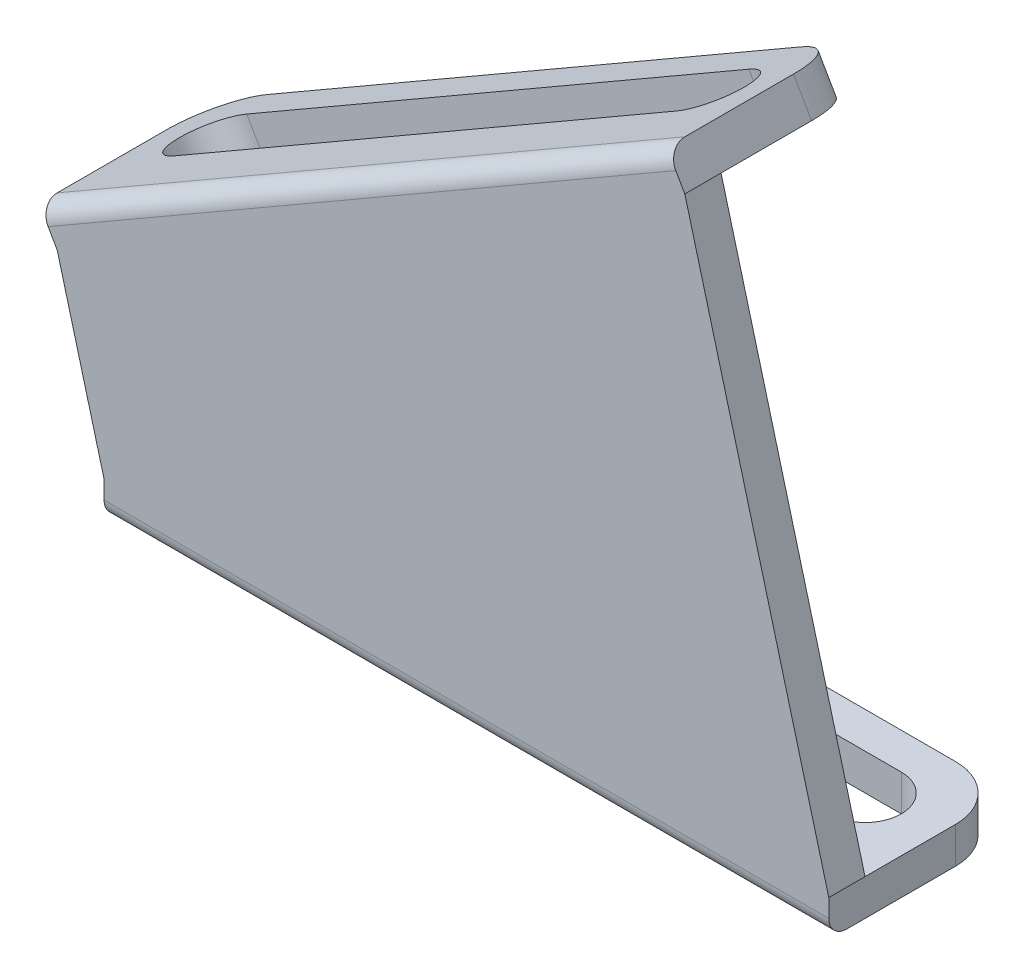
ISO-10303-21;
HEADER;
FILE_DESCRIPTION(('STEP AP214'),'2;1');
FILE_NAME('part.step','',(''),(''),'','','');
FILE_SCHEMA(('AUTOMOTIVE_DESIGN { 1 0 10303 214 1 1 1 1 }'));
ENDSEC;
DATA;
#1=APPLICATION_CONTEXT('core data for automotive mechanical design processes');
#2=APPLICATION_PROTOCOL_DEFINITION('international standard','automotive_design',2000,#1);
#3=PRODUCT_CONTEXT('',#1,'mechanical');
#4=PRODUCT('Part','Part','',(#3));
#5=PRODUCT_RELATED_PRODUCT_CATEGORY('part','',(#4));
#6=PRODUCT_DEFINITION_FORMATION('','',#4);
#7=PRODUCT_DEFINITION_CONTEXT('part definition',#1,'design');
#8=PRODUCT_DEFINITION('design','',#6,#7);
#9=PRODUCT_DEFINITION_SHAPE('','',#8);
#10=(LENGTH_UNIT() NAMED_UNIT(*) SI_UNIT(.MILLI.,.METRE.));
#11=(NAMED_UNIT(*) PLANE_ANGLE_UNIT() SI_UNIT($,.RADIAN.));
#12=(NAMED_UNIT(*) SI_UNIT($,.STERADIAN.) SOLID_ANGLE_UNIT());
#13=UNCERTAINTY_MEASURE_WITH_UNIT(LENGTH_MEASURE(1.E-05),#10,'distance_accuracy_value','');
#14=(GEOMETRIC_REPRESENTATION_CONTEXT(3) GLOBAL_UNCERTAINTY_ASSIGNED_CONTEXT((#13)) GLOBAL_UNIT_ASSIGNED_CONTEXT((#10,
#11,#12)) REPRESENTATION_CONTEXT('',''));
#15=CARTESIAN_POINT('',(0.,0.,0.));
#16=DIRECTION('',(0.,0.,1.));
#17=DIRECTION('',(1.,0.,0.));
#18=AXIS2_PLACEMENT_3D('',#15,#16,#17);
#19=CARTESIAN_POINT('',(3.,2.,-7.));
#20=DIRECTION('',(0.,-1.,0.));
#21=DIRECTION('',(0.,0.,-1.));
#22=AXIS2_PLACEMENT_3D('',#19,#20,#21);
#23=PLANE('',#22);
#24=DIRECTION('',(0.,0.,1.));
#25=VECTOR('',#24,1.);
#26=CARTESIAN_POINT('',(0.,2.,0.));
#27=LINE('',#26,#25);
#28=CARTESIAN_POINT('',(0.,2.,-6.99999999999998));
#29=VERTEX_POINT('',#28);
#30=CARTESIAN_POINT('',(0.,2.,-2.));
#31=VERTEX_POINT('',#30);
#32=EDGE_CURVE('E330',#29,#31,#27,.T.);
#33=ORIENTED_EDGE('',*,*,#32,.T.);
#34=DIRECTION('',(1.,0.,0.));
#35=VECTOR('',#34,1.);
#36=CARTESIAN_POINT('',(0.,2.,-2.));
#37=LINE('',#36,#35);
#38=CARTESIAN_POINT('',(40.,2.,-2.));
#39=VERTEX_POINT('',#38);
#40=EDGE_CURVE('E273',#31,#39,#37,.T.);
#41=ORIENTED_EDGE('',*,*,#40,.T.);
#42=DIRECTION('',(0.,0.,-1.));
#43=VECTOR('',#42,1.);
#44=CARTESIAN_POINT('',(40.,2.,0.));
#45=LINE('',#44,#43);
#46=CARTESIAN_POINT('',(40.,2.,-6.99999999999998));
#47=VERTEX_POINT('',#46);
#48=EDGE_CURVE('E333',#39,#47,#45,.T.);
#49=ORIENTED_EDGE('',*,*,#48,.T.);
#50=CARTESIAN_POINT('',(37.,2.,-7.));
#51=DIRECTION('',(0.,1.,0.));
#52=DIRECTION('',(0.,0.,-1.));
#53=AXIS2_PLACEMENT_3D('',#50,#51,#52);
#54=CIRCLE('',#53,3.);
#55=CARTESIAN_POINT('',(37.,2.,-10.));
#56=VERTEX_POINT('',#55);
#57=EDGE_CURVE('E338',#47,#56,#54,.T.);
#58=ORIENTED_EDGE('',*,*,#57,.T.);
#59=DIRECTION('',(-1.,0.,0.));
#60=VECTOR('',#59,1.);
#61=CARTESIAN_POINT('',(3.00000000000002,2.,-10.));
#62=LINE('',#61,#60);
#63=CARTESIAN_POINT('',(3.00000000000002,2.,-10.));
#64=VERTEX_POINT('',#63);
#65=EDGE_CURVE('E340',#56,#64,#62,.T.);
#66=ORIENTED_EDGE('',*,*,#65,.T.);
#67=CARTESIAN_POINT('',(3.,2.,-7.));
#68=DIRECTION('',(0.,1.,0.));
#69=DIRECTION('',(0.,0.,-1.));
#70=AXIS2_PLACEMENT_3D('',#67,#68,#69);
#71=CIRCLE('',#70,3.);
#72=EDGE_CURVE('E342',#64,#29,#71,.T.);
#73=ORIENTED_EDGE('',*,*,#72,.T.);
#74=EDGE_LOOP('',(#33,#41,#49,#58,#66,#73));
#75=FACE_BOUND('',#74,.T.);
#76=CARTESIAN_POINT('',(4.,2.,-6.));
#77=DIRECTION('',(0.,1.,0.));
#78=DIRECTION('',(0.,0.,1.));
#79=AXIS2_PLACEMENT_3D('',#76,#77,#78);
#80=CIRCLE('',#79,2.);
#81=CARTESIAN_POINT('',(4.,2.,-8.));
#82=VERTEX_POINT('',#81);
#83=CARTESIAN_POINT('',(4.,2.,-4.));
#84=VERTEX_POINT('',#83);
#85=EDGE_CURVE('E299',#82,#84,#80,.T.);
#86=ORIENTED_EDGE('',*,*,#85,.F.);
#87=DIRECTION('',(-1.,0.,0.));
#88=VECTOR('',#87,1.);
#89=CARTESIAN_POINT('',(4.,2.,-8.));
#90=LINE('',#89,#88);
#91=CARTESIAN_POINT('',(36.,2.,-8.));
#92=VERTEX_POINT('',#91);
#93=EDGE_CURVE('E307',#92,#82,#90,.T.);
#94=ORIENTED_EDGE('',*,*,#93,.F.);
#95=CARTESIAN_POINT('',(36.,2.,-6.));
#96=DIRECTION('',(0.,1.,0.));
#97=DIRECTION('',(0.,0.,1.));
#98=AXIS2_PLACEMENT_3D('',#95,#96,#97);
#99=CIRCLE('',#98,2.);
#100=CARTESIAN_POINT('',(36.,2.,-4.));
#101=VERTEX_POINT('',#100);
#102=EDGE_CURVE('E304',#101,#92,#99,.T.);
#103=ORIENTED_EDGE('',*,*,#102,.F.);
#104=DIRECTION('',(1.,0.,0.));
#105=VECTOR('',#104,1.);
#106=CARTESIAN_POINT('',(36.,2.,-4.));
#107=LINE('',#106,#105);
#108=EDGE_CURVE('E301',#84,#101,#107,.T.);
#109=ORIENTED_EDGE('',*,*,#108,.F.);
#110=EDGE_LOOP('',(#86,#94,#103,#109));
#111=FACE_BOUND('',#110,.T.);
#112=ADVANCED_FACE('F33',(#75,#111),#23,.F.);
#113=CARTESIAN_POINT('',(3.,0.,-7.));
#114=DIRECTION('',(0.,-1.,0.));
#115=DIRECTION('',(0.,0.,-1.));
#116=AXIS2_PLACEMENT_3D('',#113,#114,#115);
#117=PLANE('',#116);
#118=DIRECTION('',(0.,0.,-1.));
#119=VECTOR('',#118,1.);
#120=CARTESIAN_POINT('',(40.,0.,0.));
#121=LINE('',#120,#119);
#122=CARTESIAN_POINT('',(40.,0.,-1.));
#123=VERTEX_POINT('',#122);
#124=CARTESIAN_POINT('',(40.,0.,-6.99999999999998));
#125=VERTEX_POINT('',#124);
#126=EDGE_CURVE('E347',#123,#125,#121,.T.);
#127=ORIENTED_EDGE('',*,*,#126,.F.);
#128=DIRECTION('',(1.,0.,0.));
#129=VECTOR('',#128,1.);
#130=CARTESIAN_POINT('',(0.,0.,-1.));
#131=LINE('',#130,#129);
#132=CARTESIAN_POINT('',(0.,0.,-1.));
#133=VERTEX_POINT('',#132);
#134=EDGE_CURVE('E376',#123,#133,#131,.F.);
#135=ORIENTED_EDGE('',*,*,#134,.T.);
#136=DIRECTION('',(0.,0.,1.));
#137=VECTOR('',#136,1.);
#138=CARTESIAN_POINT('',(0.,0.,0.));
#139=LINE('',#138,#137);
#140=CARTESIAN_POINT('',(0.,0.,-6.99999999999998));
#141=VERTEX_POINT('',#140);
#142=EDGE_CURVE('E329',#141,#133,#139,.T.);
#143=ORIENTED_EDGE('',*,*,#142,.F.);
#144=CARTESIAN_POINT('',(3.,0.,-7.));
#145=DIRECTION('',(0.,1.,0.));
#146=DIRECTION('',(0.,0.,-1.));
#147=AXIS2_PLACEMENT_3D('',#144,#145,#146);
#148=CIRCLE('',#147,3.);
#149=CARTESIAN_POINT('',(3.00000000000002,0.,-10.));
#150=VERTEX_POINT('',#149);
#151=EDGE_CURVE('E334',#150,#141,#148,.T.);
#152=ORIENTED_EDGE('',*,*,#151,.F.);
#153=DIRECTION('',(-1.,0.,0.));
#154=VECTOR('',#153,1.);
#155=CARTESIAN_POINT('',(3.00000000000002,0.,-10.));
#156=LINE('',#155,#154);
#157=CARTESIAN_POINT('',(37.,0.,-10.));
#158=VERTEX_POINT('',#157);
#159=EDGE_CURVE('E351',#158,#150,#156,.T.);
#160=ORIENTED_EDGE('',*,*,#159,.F.);
#161=CARTESIAN_POINT('',(37.,0.,-7.));
#162=DIRECTION('',(0.,1.,0.));
#163=DIRECTION('',(0.,0.,-1.));
#164=AXIS2_PLACEMENT_3D('',#161,#162,#163);
#165=CIRCLE('',#164,3.);
#166=EDGE_CURVE('E349',#125,#158,#165,.T.);
#167=ORIENTED_EDGE('',*,*,#166,.F.);
#168=EDGE_LOOP('',(#127,#135,#143,#152,#160,#167));
#169=FACE_BOUND('',#168,.T.);
#170=DIRECTION('',(-1.,0.,0.));
#171=VECTOR('',#170,1.);
#172=CARTESIAN_POINT('',(4.,0.,-8.));
#173=LINE('',#172,#171);
#174=CARTESIAN_POINT('',(36.,0.,-8.));
#175=VERTEX_POINT('',#174);
#176=CARTESIAN_POINT('',(4.,0.,-8.));
#177=VERTEX_POINT('',#176);
#178=EDGE_CURVE('E302',#175,#177,#173,.T.);
#179=ORIENTED_EDGE('',*,*,#178,.T.);
#180=CARTESIAN_POINT('',(4.,0.,-6.));
#181=DIRECTION('',(0.,1.,0.));
#182=DIRECTION('',(0.,0.,1.));
#183=AXIS2_PLACEMENT_3D('',#180,#181,#182);
#184=CIRCLE('',#183,2.);
#185=CARTESIAN_POINT('',(4.,0.,-4.));
#186=VERTEX_POINT('',#185);
#187=EDGE_CURVE('E293',#177,#186,#184,.T.);
#188=ORIENTED_EDGE('',*,*,#187,.T.);
#189=DIRECTION('',(1.,0.,0.));
#190=VECTOR('',#189,1.);
#191=CARTESIAN_POINT('',(36.,0.,-4.));
#192=LINE('',#191,#190);
#193=CARTESIAN_POINT('',(36.,0.,-4.));
#194=VERTEX_POINT('',#193);
#195=EDGE_CURVE('E312',#186,#194,#192,.T.);
#196=ORIENTED_EDGE('',*,*,#195,.T.);
#197=CARTESIAN_POINT('',(36.,0.,-6.));
#198=DIRECTION('',(0.,1.,0.));
#199=DIRECTION('',(0.,0.,1.));
#200=AXIS2_PLACEMENT_3D('',#197,#198,#199);
#201=CIRCLE('',#200,2.);
#202=EDGE_CURVE('E315',#194,#175,#201,.T.);
#203=ORIENTED_EDGE('',*,*,#202,.T.);
#204=EDGE_LOOP('',(#179,#188,#196,#203));
#205=FACE_BOUND('',#204,.T.);
#206=ADVANCED_FACE('F418',(#169,#205),#117,.T.);
#207=CARTESIAN_POINT('',(0.,2.,0.));
#208=DIRECTION('',(1.,0.,0.));
#209=DIRECTION('',(0.,0.,-1.));
#210=AXIS2_PLACEMENT_3D('',#207,#208,#209);
#211=PLANE('',#210);
#212=ORIENTED_EDGE('',*,*,#142,.T.);
#213=CARTESIAN_POINT('',(0.,1.,-1.));
#214=DIRECTION('',(1.,0.,0.));
#215=DIRECTION('',(0.,0.,-1.));
#216=AXIS2_PLACEMENT_3D('',#213,#214,#215);
#217=CIRCLE('',#216,1.);
#218=CARTESIAN_POINT('',(0.,1.,0.));
#219=VERTEX_POINT('',#218);
#220=EDGE_CURVE('E378',#133,#219,#217,.F.);
#221=ORIENTED_EDGE('',*,*,#220,.T.);
#222=DIRECTION('',(0.,-1.,0.));
#223=VECTOR('',#222,1.);
#224=CARTESIAN_POINT('',(0.,2.,0.));
#225=LINE('',#224,#223);
#226=CARTESIAN_POINT('',(0.,2.,0.));
#227=VERTEX_POINT('',#226);
#228=EDGE_CURVE('E368',#227,#219,#225,.T.);
#229=ORIENTED_EDGE('',*,*,#228,.F.);
#230=DIRECTION('',(0.,0.,1.));
#231=VECTOR('',#230,1.);
#232=CARTESIAN_POINT('',(0.,2.,-2.));
#233=LINE('',#232,#231);
#234=EDGE_CURVE('E291',#31,#227,#233,.T.);
#235=ORIENTED_EDGE('',*,*,#234,.F.);
#236=ORIENTED_EDGE('',*,*,#32,.F.);
#237=DIRECTION('',(0.,-1.,0.));
#238=VECTOR('',#237,1.);
#239=CARTESIAN_POINT('',(0.,2.,-6.99999999999998));
#240=LINE('',#239,#238);
#241=EDGE_CURVE('E344',#29,#141,#240,.T.);
#242=ORIENTED_EDGE('',*,*,#241,.T.);
#243=EDGE_LOOP('',(#212,#221,#229,#235,#236,#242));
#244=FACE_BOUND('',#243,.T.);
#245=ADVANCED_FACE('F424',(#244),#211,.F.);
#246=CARTESIAN_POINT('',(0.,2.,0.));
#247=DIRECTION('',(0.,0.,-1.));
#248=DIRECTION('',(-1.,0.,0.));
#249=AXIS2_PLACEMENT_3D('',#246,#247,#248);
#250=PLANE('',#249);
#251=DIRECTION('',(0.500000000000001,-0.866025403784438,0.));
#252=VECTOR('',#251,1.);
#253=CARTESIAN_POINT('',(31.0528257003524,33.3913090704597,0.));
#254=LINE('',#253,#252);
#255=CARTESIAN_POINT('',(31.5528257003524,32.5252836666752,0.));
#256=VERTEX_POINT('',#255);
#257=CARTESIAN_POINT('',(32.0528257003524,31.6592582628908,0.));
#258=VERTEX_POINT('',#257);
#259=EDGE_CURVE('E268',#256,#258,#254,.T.);
#260=ORIENTED_EDGE('',*,*,#259,.F.);
#261=DIRECTION('',(0.866025403784438,0.500000000000001,0.));
#262=VECTOR('',#261,1.);
#263=CARTESIAN_POINT('',(-5.32962913144536,11.2311884411625,0.));
#264=LINE('',#263,#262);
#265=CARTESIAN_POINT('',(-3.08819045102525,12.5252836666751,0.));
#266=VERTEX_POINT('',#265);
#267=EDGE_CURVE('E41',#256,#266,#264,.F.);
#268=ORIENTED_EDGE('',*,*,#267,.T.);
#269=DIRECTION('',(0.500000000000001,-0.866025403784438,0.));
#270=VECTOR('',#269,1.);
#271=CARTESIAN_POINT('',(-3.58819045102525,13.3913090704595,0.));
#272=LINE('',#271,#270);
#273=CARTESIAN_POINT('',(-2.58819045102525,11.6592582628907,0.));
#274=VERTEX_POINT('',#273);
#275=EDGE_CURVE('E270',#266,#274,#272,.T.);
#276=ORIENTED_EDGE('',*,*,#275,.T.);
#277=DIRECTION('',(0.258819045102525,-0.965925826289067,0.));
#278=VECTOR('',#277,1.);
#279=CARTESIAN_POINT('',(0.,2.,0.));
#280=LINE('',#279,#278);
#281=EDGE_CURVE('E277',#274,#227,#280,.T.);
#282=ORIENTED_EDGE('',*,*,#281,.T.);
#283=ORIENTED_EDGE('',*,*,#228,.T.);
#284=DIRECTION('',(1.,0.,0.));
#285=VECTOR('',#284,1.);
#286=CARTESIAN_POINT('',(40.,1.,0.));
#287=LINE('',#286,#285);
#288=CARTESIAN_POINT('',(40.,1.,0.));
#289=VERTEX_POINT('',#288);
#290=EDGE_CURVE('E371',#219,#289,#287,.T.);
#291=ORIENTED_EDGE('',*,*,#290,.T.);
#292=DIRECTION('',(0.,-1.,0.));
#293=VECTOR('',#292,1.);
#294=CARTESIAN_POINT('',(40.,2.,0.));
#295=LINE('',#294,#293);
#296=CARTESIAN_POINT('',(40.,2.,0.));
#297=VERTEX_POINT('',#296);
#298=EDGE_CURVE('E365',#297,#289,#295,.T.);
#299=ORIENTED_EDGE('',*,*,#298,.F.);
#300=DIRECTION('',(-0.258819045102518,0.965925826289069,0.));
#301=VECTOR('',#300,1.);
#302=CARTESIAN_POINT('',(32.0528257003524,31.6592582628908,0.));
#303=LINE('',#302,#301);
#304=EDGE_CURVE('E272',#297,#258,#303,.T.);
#305=ORIENTED_EDGE('',*,*,#304,.T.);
#306=EDGE_LOOP('',(#260,#268,#276,#282,#283,#291,#299,#305));
#307=FACE_BOUND('',#306,.T.);
#308=ADVANCED_FACE('F447',(#307),#250,.F.);
#309=CARTESIAN_POINT('',(40.,2.,0.));
#310=DIRECTION('',(-1.,0.,0.));
#311=DIRECTION('',(0.,0.,1.));
#312=AXIS2_PLACEMENT_3D('',#309,#310,#311);
#313=PLANE('',#312);
#314=ORIENTED_EDGE('',*,*,#298,.T.);
#315=CARTESIAN_POINT('',(40.,1.,-1.));
#316=DIRECTION('',(-1.,0.,0.));
#317=DIRECTION('',(0.,0.,1.));
#318=AXIS2_PLACEMENT_3D('',#315,#316,#317);
#319=CIRCLE('',#318,1.);
#320=EDGE_CURVE('E374',#289,#123,#319,.F.);
#321=ORIENTED_EDGE('',*,*,#320,.T.);
#322=ORIENTED_EDGE('',*,*,#126,.T.);
#323=DIRECTION('',(0.,-1.,0.));
#324=VECTOR('',#323,1.);
#325=CARTESIAN_POINT('',(40.,2.,-6.99999999999998));
#326=LINE('',#325,#324);
#327=EDGE_CURVE('E362',#47,#125,#326,.T.);
#328=ORIENTED_EDGE('',*,*,#327,.F.);
#329=ORIENTED_EDGE('',*,*,#48,.F.);
#330=EDGE_CURVE('E335',#297,#39,#45,.T.);
#331=ORIENTED_EDGE('',*,*,#330,.F.);
#332=EDGE_LOOP('',(#314,#321,#322,#328,#329,#331));
#333=FACE_BOUND('',#332,.T.);
#334=ADVANCED_FACE('F443',(#333),#313,.F.);
#335=CARTESIAN_POINT('',(37.,2.,-7.));
#336=DIRECTION('',(0.,-1.,0.));
#337=DIRECTION('',(0.,0.,-1.));
#338=AXIS2_PLACEMENT_3D('',#335,#336,#337);
#339=CYLINDRICAL_SURFACE('',#338,3.);
#340=ORIENTED_EDGE('',*,*,#166,.T.);
#341=DIRECTION('',(0.,-1.,0.));
#342=VECTOR('',#341,1.);
#343=CARTESIAN_POINT('',(37.,2.,-10.));
#344=LINE('',#343,#342);
#345=EDGE_CURVE('E359',#56,#158,#344,.T.);
#346=ORIENTED_EDGE('',*,*,#345,.F.);
#347=ORIENTED_EDGE('',*,*,#57,.F.);
#348=ORIENTED_EDGE('',*,*,#327,.T.);
#349=EDGE_LOOP('',(#340,#346,#347,#348));
#350=FACE_BOUND('',#349,.T.);
#351=ADVANCED_FACE('F439',(#350),#339,.T.);
#352=CARTESIAN_POINT('',(3.00000000000002,2.,-10.));
#353=DIRECTION('',(0.,0.,1.));
#354=DIRECTION('',(1.,0.,0.));
#355=AXIS2_PLACEMENT_3D('',#352,#353,#354);
#356=PLANE('',#355);
#357=ORIENTED_EDGE('',*,*,#159,.T.);
#358=DIRECTION('',(0.,-1.,0.));
#359=VECTOR('',#358,1.);
#360=CARTESIAN_POINT('',(3.00000000000002,2.,-10.));
#361=LINE('',#360,#359);
#362=EDGE_CURVE('E356',#64,#150,#361,.T.);
#363=ORIENTED_EDGE('',*,*,#362,.F.);
#364=ORIENTED_EDGE('',*,*,#65,.F.);
#365=ORIENTED_EDGE('',*,*,#345,.T.);
#366=EDGE_LOOP('',(#357,#363,#364,#365));
#367=FACE_BOUND('',#366,.T.);
#368=ADVANCED_FACE('F435',(#367),#356,.F.);
#369=CARTESIAN_POINT('',(3.,2.,-7.));
#370=DIRECTION('',(0.,-1.,0.));
#371=DIRECTION('',(0.,0.,-1.));
#372=AXIS2_PLACEMENT_3D('',#369,#370,#371);
#373=CYLINDRICAL_SURFACE('',#372,3.);
#374=ORIENTED_EDGE('',*,*,#151,.T.);
#375=ORIENTED_EDGE('',*,*,#241,.F.);
#376=ORIENTED_EDGE('',*,*,#72,.F.);
#377=ORIENTED_EDGE('',*,*,#362,.T.);
#378=EDGE_LOOP('',(#374,#375,#376,#377));
#379=FACE_BOUND('',#378,.T.);
#380=ADVANCED_FACE('F432',(#379),#373,.T.);
#381=CARTESIAN_POINT('',(4.,2.,-6.));
#382=DIRECTION('',(0.,-1.,0.));
#383=DIRECTION('',(0.,0.,-1.));
#384=AXIS2_PLACEMENT_3D('',#381,#382,#383);
#385=CYLINDRICAL_SURFACE('',#384,2.);
#386=ORIENTED_EDGE('',*,*,#187,.F.);
#387=DIRECTION('',(0.,-1.,0.));
#388=VECTOR('',#387,1.);
#389=CARTESIAN_POINT('',(4.,2.,-8.));
#390=LINE('',#389,#388);
#391=EDGE_CURVE('E309',#82,#177,#390,.T.);
#392=ORIENTED_EDGE('',*,*,#391,.F.);
#393=ORIENTED_EDGE('',*,*,#85,.T.);
#394=DIRECTION('',(0.,-1.,0.));
#395=VECTOR('',#394,1.);
#396=CARTESIAN_POINT('',(4.,2.,-4.));
#397=LINE('',#396,#395);
#398=EDGE_CURVE('E326',#84,#186,#397,.T.);
#399=ORIENTED_EDGE('',*,*,#398,.T.);
#400=EDGE_LOOP('',(#386,#392,#393,#399));
#401=FACE_BOUND('',#400,.T.);
#402=ADVANCED_FACE('F429',(#401),#385,.F.);
#403=CARTESIAN_POINT('',(36.,2.,-4.));
#404=DIRECTION('',(0.,0.,-1.));
#405=DIRECTION('',(-1.,0.,0.));
#406=AXIS2_PLACEMENT_3D('',#403,#404,#405);
#407=PLANE('',#406);
#408=ORIENTED_EDGE('',*,*,#195,.F.);
#409=ORIENTED_EDGE('',*,*,#398,.F.);
#410=ORIENTED_EDGE('',*,*,#108,.T.);
#411=DIRECTION('',(0.,-1.,0.));
#412=VECTOR('',#411,1.);
#413=CARTESIAN_POINT('',(36.,2.,-4.));
#414=LINE('',#413,#412);
#415=EDGE_CURVE('E324',#101,#194,#414,.T.);
#416=ORIENTED_EDGE('',*,*,#415,.T.);
#417=EDGE_LOOP('',(#408,#409,#410,#416));
#418=FACE_BOUND('',#417,.T.);
#419=ADVANCED_FACE('F522',(#418),#407,.T.);
#420=CARTESIAN_POINT('',(36.,2.,-6.));
#421=DIRECTION('',(0.,-1.,0.));
#422=DIRECTION('',(0.,0.,-1.));
#423=AXIS2_PLACEMENT_3D('',#420,#421,#422);
#424=CYLINDRICAL_SURFACE('',#423,2.);
#425=ORIENTED_EDGE('',*,*,#202,.F.);
#426=ORIENTED_EDGE('',*,*,#415,.F.);
#427=ORIENTED_EDGE('',*,*,#102,.T.);
#428=DIRECTION('',(0.,-1.,0.));
#429=VECTOR('',#428,1.);
#430=CARTESIAN_POINT('',(36.,2.,-8.));
#431=LINE('',#430,#429);
#432=EDGE_CURVE('E322',#92,#175,#431,.T.);
#433=ORIENTED_EDGE('',*,*,#432,.T.);
#434=EDGE_LOOP('',(#425,#426,#427,#433));
#435=FACE_BOUND('',#434,.T.);
#436=ADVANCED_FACE('F519',(#435),#424,.F.);
#437=CARTESIAN_POINT('',(4.,2.,-8.));
#438=DIRECTION('',(0.,0.,1.));
#439=DIRECTION('',(1.,0.,0.));
#440=AXIS2_PLACEMENT_3D('',#437,#438,#439);
#441=PLANE('',#440);
#442=ORIENTED_EDGE('',*,*,#178,.F.);
#443=ORIENTED_EDGE('',*,*,#432,.F.);
#444=ORIENTED_EDGE('',*,*,#93,.T.);
#445=ORIENTED_EDGE('',*,*,#391,.T.);
#446=EDGE_LOOP('',(#442,#443,#444,#445));
#447=FACE_BOUND('',#446,.T.);
#448=ADVANCED_FACE('F514',(#447),#441,.T.);
#449=CARTESIAN_POINT('',(0.,2.,-2.));
#450=DIRECTION('',(-0.965925826289067,-0.258819045102525,0.));
#451=DIRECTION('',(0.258819045102525,-0.965925826289067,0.));
#452=AXIS2_PLACEMENT_3D('',#449,#450,#451);
#453=PLANE('',#452);
#454=ORIENTED_EDGE('',*,*,#281,.F.);
#455=DIRECTION('',(0.,0.,1.));
#456=VECTOR('',#455,1.);
#457=CARTESIAN_POINT('',(-2.58819045102525,11.6592582628907,-2.));
#458=LINE('',#457,#456);
#459=CARTESIAN_POINT('',(-2.58819045102525,11.6592582628907,-2.));
#460=VERTEX_POINT('',#459);
#461=EDGE_CURVE('E294',#460,#274,#458,.T.);
#462=ORIENTED_EDGE('',*,*,#461,.F.);
#463=DIRECTION('',(0.258819045102525,-0.965925826289067,0.));
#464=VECTOR('',#463,1.);
#465=CARTESIAN_POINT('',(0.,2.,-2.));
#466=LINE('',#465,#464);
#467=EDGE_CURVE('E283',#460,#31,#466,.T.);
#468=ORIENTED_EDGE('',*,*,#467,.T.);
#469=ORIENTED_EDGE('',*,*,#234,.T.);
#470=EDGE_LOOP('',(#454,#462,#468,#469));
#471=FACE_BOUND('',#470,.T.);
#472=ADVANCED_FACE('F476',(#471),#453,.T.);
#473=CARTESIAN_POINT('',(32.0528257003524,31.6592582628908,-2.));
#474=DIRECTION('',(0.965925826289069,0.258819045102518,0.));
#475=DIRECTION('',(-0.258819045102518,0.965925826289069,0.));
#476=AXIS2_PLACEMENT_3D('',#473,#474,#475);
#477=PLANE('',#476);
#478=ORIENTED_EDGE('',*,*,#304,.F.);
#479=ORIENTED_EDGE('',*,*,#330,.T.);
#480=DIRECTION('',(-0.258819045102518,0.965925826289069,0.));
#481=VECTOR('',#480,1.);
#482=CARTESIAN_POINT('',(32.0528257003524,31.6592582628908,-2.));
#483=LINE('',#482,#481);
#484=CARTESIAN_POINT('',(32.0528257003524,31.6592582628908,-2.));
#485=VERTEX_POINT('',#484);
#486=EDGE_CURVE('E276',#39,#485,#483,.T.);
#487=ORIENTED_EDGE('',*,*,#486,.T.);
#488=DIRECTION('',(0.,0.,1.));
#489=VECTOR('',#488,1.);
#490=CARTESIAN_POINT('',(32.0528257003524,31.6592582628908,-2.));
#491=LINE('',#490,#489);
#492=EDGE_CURVE('E286',#485,#258,#491,.T.);
#493=ORIENTED_EDGE('',*,*,#492,.T.);
#494=EDGE_LOOP('',(#478,#479,#487,#493));
#495=FACE_BOUND('',#494,.T.);
#496=ADVANCED_FACE('F469',(#495),#477,.T.);
#497=CARTESIAN_POINT('',(0.,0.,-2.));
#498=DIRECTION('',(0.,0.,-1.));
#499=DIRECTION('',(-1.,0.,0.));
#500=AXIS2_PLACEMENT_3D('',#497,#498,#499);
#501=PLANE('',#500);
#502=ORIENTED_EDGE('',*,*,#40,.F.);
#503=ORIENTED_EDGE('',*,*,#467,.F.);
#504=DIRECTION('',(-0.866025403784438,-0.500000000000001,0.));
#505=VECTOR('',#504,1.);
#506=CARTESIAN_POINT('',(-2.58819045102525,11.6592582628907,-2.));
#507=LINE('',#506,#505);
#508=EDGE_CURVE('E280',#485,#460,#507,.T.);
#509=ORIENTED_EDGE('',*,*,#508,.F.);
#510=ORIENTED_EDGE('',*,*,#486,.F.);
#511=EDGE_LOOP('',(#502,#503,#509,#510));
#512=FACE_BOUND('',#511,.T.);
#513=ADVANCED_FACE('F471',(#512),#501,.T.);
#514=CARTESIAN_POINT('',(-0.990114239671939,14.8913090704596,-7.));
#515=DIRECTION('',(0.500000000000001,-0.866025403784438,0.));
#516=DIRECTION('',(0.866025403784438,0.500000000000001,0.));
#517=AXIS2_PLACEMENT_3D('',#514,#515,#516);
#518=PLANE('',#517);
#519=DIRECTION('',(0.,0.,1.));
#520=VECTOR('',#519,1.);
#521=CARTESIAN_POINT('',(-3.58819045102525,13.3913090704595,0.));
#522=LINE('',#521,#520);
#523=CARTESIAN_POINT('',(-3.58819045102525,13.3913090704595,-6.99999999999998));
#524=VERTEX_POINT('',#523);
#525=CARTESIAN_POINT('',(-3.58819045102525,13.3913090704595,-1.));
#526=VERTEX_POINT('',#525);
#527=EDGE_CURVE('E235',#524,#526,#522,.T.);
#528=ORIENTED_EDGE('',*,*,#527,.T.);
#529=DIRECTION('',(0.866025403784438,0.500000000000001,0.));
#530=VECTOR('',#529,1.);
#531=CARTESIAN_POINT('',(-0.990114239671939,14.8913090704596,-1.));
#532=LINE('',#531,#530);
#533=CARTESIAN_POINT('',(31.0528257003524,33.3913090704597,-1.));
#534=VERTEX_POINT('',#533);
#535=EDGE_CURVE('E380',#526,#534,#532,.T.);
#536=ORIENTED_EDGE('',*,*,#535,.T.);
#537=DIRECTION('',(0.,0.,-1.));
#538=VECTOR('',#537,1.);
#539=CARTESIAN_POINT('',(31.0528257003524,33.3913090704597,0.));
#540=LINE('',#539,#538);
#541=CARTESIAN_POINT('',(31.0528257003524,33.3913090704597,-6.99999999999998));
#542=VERTEX_POINT('',#541);
#543=EDGE_CURVE('E238',#534,#542,#540,.T.);
#544=ORIENTED_EDGE('',*,*,#543,.T.);
#545=CARTESIAN_POINT('',(28.4547494889991,31.8913090704597,-7.));
#546=DIRECTION('',(-0.500000000000001,0.866025403784438,0.));
#547=DIRECTION('',(0.866025403784438,0.500000000000001,0.));
#548=AXIS2_PLACEMENT_3D('',#545,#546,#547);
#549=CIRCLE('',#548,3.);
#550=CARTESIAN_POINT('',(28.4547494889991,31.8913090704597,-10.));
#551=VERTEX_POINT('',#550);
#552=EDGE_CURVE('E241',#542,#551,#549,.T.);
#553=ORIENTED_EDGE('',*,*,#552,.T.);
#554=DIRECTION('',(-0.866025403784438,-0.500000000000001,0.));
#555=VECTOR('',#554,1.);
#556=CARTESIAN_POINT('',(-0.990114239671921,14.8913090704596,-10.));
#557=LINE('',#556,#555);
#558=CARTESIAN_POINT('',(-0.990114239671921,14.8913090704596,-10.));
#559=VERTEX_POINT('',#558);
#560=EDGE_CURVE('E243',#551,#559,#557,.T.);
#561=ORIENTED_EDGE('',*,*,#560,.T.);
#562=CARTESIAN_POINT('',(-0.990114239671939,14.8913090704596,-7.));
#563=DIRECTION('',(-0.500000000000001,0.866025403784438,0.));
#564=DIRECTION('',(0.866025403784438,0.500000000000001,0.));
#565=AXIS2_PLACEMENT_3D('',#562,#563,#564);
#566=CIRCLE('',#565,3.);
#567=EDGE_CURVE('E245',#559,#524,#566,.T.);
#568=ORIENTED_EDGE('',*,*,#567,.T.);
#569=EDGE_LOOP('',(#528,#536,#544,#553,#561,#568));
#570=FACE_BOUND('',#569,.T.);
#571=CARTESIAN_POINT('',(-0.124088835887501,15.3913090704596,-6.));
#572=DIRECTION('',(-0.500000000000001,0.866025403784438,0.));
#573=DIRECTION('',(-0.866025403784438,-0.500000000000001,0.));
#574=AXIS2_PLACEMENT_3D('',#571,#572,#573);
#575=CIRCLE('',#574,2.);
#576=CARTESIAN_POINT('',(-0.124088835887501,15.3913090704596,-8.));
#577=VERTEX_POINT('',#576);
#578=CARTESIAN_POINT('',(-0.124088835887501,15.3913090704596,-4.));
#579=VERTEX_POINT('',#578);
#580=EDGE_CURVE('E193',#577,#579,#575,.T.);
#581=ORIENTED_EDGE('',*,*,#580,.F.);
#582=DIRECTION('',(-0.866025403784438,-0.500000000000001,0.));
#583=VECTOR('',#582,1.);
#584=CARTESIAN_POINT('',(27.5887240852146,31.3913090704597,-8.));
#585=LINE('',#584,#583);
#586=CARTESIAN_POINT('',(27.5887240852147,31.3913090704597,-8.));
#587=VERTEX_POINT('',#586);
#588=EDGE_CURVE('E219',#587,#577,#585,.T.);
#589=ORIENTED_EDGE('',*,*,#588,.F.);
#590=CARTESIAN_POINT('',(27.5887240852146,31.3913090704597,-6.));
#591=DIRECTION('',(-0.500000000000001,0.866025403784438,0.));
#592=DIRECTION('',(-0.866025403784438,-0.500000000000001,0.));
#593=AXIS2_PLACEMENT_3D('',#590,#591,#592);
#594=CIRCLE('',#593,2.);
#595=CARTESIAN_POINT('',(27.5887240852146,31.3913090704597,-4.));
#596=VERTEX_POINT('',#595);
#597=EDGE_CURVE('E217',#596,#587,#594,.T.);
#598=ORIENTED_EDGE('',*,*,#597,.F.);
#599=DIRECTION('',(0.866025403784438,0.500000000000001,0.));
#600=VECTOR('',#599,1.);
#601=CARTESIAN_POINT('',(-0.124088835887501,15.3913090704596,-4.));
#602=LINE('',#601,#600);
#603=EDGE_CURVE('E203',#579,#596,#602,.T.);
#604=ORIENTED_EDGE('',*,*,#603,.F.);
#605=EDGE_LOOP('',(#581,#589,#598,#604));
#606=FACE_BOUND('',#605,.T.);
#607=ADVANCED_FACE('F215',(#570,#606),#518,.F.);
#608=CARTESIAN_POINT('',(0.00988576032806381,13.1592582628907,-7.));
#609=DIRECTION('',(0.500000000000001,-0.866025403784438,0.));
#610=DIRECTION('',(0.866025403784438,0.500000000000001,0.));
#611=AXIS2_PLACEMENT_3D('',#608,#609,#610);
#612=PLANE('',#611);
#613=DIRECTION('',(0.,0.,-1.));
#614=VECTOR('',#613,1.);
#615=CARTESIAN_POINT('',(32.0528257003524,31.6592582628908,0.));
#616=LINE('',#615,#614);
#617=CARTESIAN_POINT('',(32.0528257003524,31.6592582628908,-6.99999999999998));
#618=VERTEX_POINT('',#617);
#619=EDGE_CURVE('E250',#485,#618,#616,.T.);
#620=ORIENTED_EDGE('',*,*,#619,.F.);
#621=ORIENTED_EDGE('',*,*,#508,.T.);
#622=DIRECTION('',(0.,0.,1.));
#623=VECTOR('',#622,1.);
#624=CARTESIAN_POINT('',(-2.58819045102525,11.6592582628907,0.));
#625=LINE('',#624,#623);
#626=CARTESIAN_POINT('',(-2.58819045102525,11.6592582628907,-6.99999999999998));
#627=VERTEX_POINT('',#626);
#628=EDGE_CURVE('E211',#627,#460,#625,.T.);
#629=ORIENTED_EDGE('',*,*,#628,.F.);
#630=CARTESIAN_POINT('',(0.00988576032806381,13.1592582628907,-7.));
#631=DIRECTION('',(-0.500000000000001,0.866025403784438,0.));
#632=DIRECTION('',(0.866025403784438,0.500000000000001,0.));
#633=AXIS2_PLACEMENT_3D('',#630,#631,#632);
#634=CIRCLE('',#633,3.);
#635=CARTESIAN_POINT('',(0.00988576032808115,13.1592582628907,-10.));
#636=VERTEX_POINT('',#635);
#637=EDGE_CURVE('E239',#636,#627,#634,.T.);
#638=ORIENTED_EDGE('',*,*,#637,.F.);
#639=DIRECTION('',(-0.866025403784438,-0.500000000000001,0.));
#640=VECTOR('',#639,1.);
#641=CARTESIAN_POINT('',(0.00988576032808115,13.1592582628907,-10.));
#642=LINE('',#641,#640);
#643=CARTESIAN_POINT('',(29.4547494889991,30.1592582628908,-10.));
#644=VERTEX_POINT('',#643);
#645=EDGE_CURVE('E254',#644,#636,#642,.T.);
#646=ORIENTED_EDGE('',*,*,#645,.F.);
#647=CARTESIAN_POINT('',(29.4547494889991,30.1592582628908,-7.));
#648=DIRECTION('',(-0.500000000000001,0.866025403784438,0.));
#649=DIRECTION('',(0.866025403784438,0.500000000000001,0.));
#650=AXIS2_PLACEMENT_3D('',#647,#648,#649);
#651=CIRCLE('',#650,3.);
#652=EDGE_CURVE('E252',#618,#644,#651,.T.);
#653=ORIENTED_EDGE('',*,*,#652,.F.);
#654=EDGE_LOOP('',(#620,#621,#629,#638,#646,#653));
#655=FACE_BOUND('',#654,.T.);
#656=DIRECTION('',(-0.866025403784438,-0.500000000000001,0.));
#657=VECTOR('',#656,1.);
#658=CARTESIAN_POINT('',(28.5887240852146,29.6592582628908,-8.));
#659=LINE('',#658,#657);
#660=CARTESIAN_POINT('',(28.5887240852146,29.6592582628908,-8.));
#661=VERTEX_POINT('',#660);
#662=CARTESIAN_POINT('',(0.875911164112501,13.6592582628907,-8.));
#663=VERTEX_POINT('',#662);
#664=EDGE_CURVE('E204',#661,#663,#659,.T.);
#665=ORIENTED_EDGE('',*,*,#664,.T.);
#666=CARTESIAN_POINT('',(0.875911164112501,13.6592582628907,-6.));
#667=DIRECTION('',(-0.500000000000001,0.866025403784438,0.));
#668=DIRECTION('',(-0.866025403784438,-0.500000000000001,0.));
#669=AXIS2_PLACEMENT_3D('',#666,#667,#668);
#670=CIRCLE('',#669,2.);
#671=CARTESIAN_POINT('',(0.875911164112501,13.6592582628907,-4.));
#672=VERTEX_POINT('',#671);
#673=EDGE_CURVE('E223',#663,#672,#670,.T.);
#674=ORIENTED_EDGE('',*,*,#673,.T.);
#675=DIRECTION('',(0.866025403784438,0.500000000000001,0.));
#676=VECTOR('',#675,1.);
#677=CARTESIAN_POINT('',(0.875911164112501,13.6592582628907,-4.));
#678=LINE('',#677,#676);
#679=CARTESIAN_POINT('',(28.5887240852146,29.6592582628908,-4.));
#680=VERTEX_POINT('',#679);
#681=EDGE_CURVE('E210',#672,#680,#678,.T.);
#682=ORIENTED_EDGE('',*,*,#681,.T.);
#683=CARTESIAN_POINT('',(28.5887240852146,29.6592582628908,-6.));
#684=DIRECTION('',(-0.500000000000001,0.866025403784438,0.));
#685=DIRECTION('',(-0.866025403784438,-0.500000000000001,0.));
#686=AXIS2_PLACEMENT_3D('',#683,#684,#685);
#687=CIRCLE('',#686,2.);
#688=EDGE_CURVE('E226',#680,#661,#687,.T.);
#689=ORIENTED_EDGE('',*,*,#688,.T.);
#690=EDGE_LOOP('',(#665,#674,#682,#689));
#691=FACE_BOUND('',#690,.T.);
#692=ADVANCED_FACE('F478',(#655,#691),#612,.T.);
#693=CARTESIAN_POINT('',(-3.58819045102525,13.3913090704595,0.));
#694=DIRECTION('',(0.866025403784438,0.500000000000001,0.));
#695=DIRECTION('',(-0.500000000000001,0.866025403784438,0.));
#696=AXIS2_PLACEMENT_3D('',#693,#694,#695);
#697=PLANE('',#696);
#698=ORIENTED_EDGE('',*,*,#275,.F.);
#699=CARTESIAN_POINT('',(-3.08819045102525,12.5252836666751,-1.));
#700=DIRECTION('',(0.866025403784438,0.500000000000001,0.));
#701=DIRECTION('',(-0.500000000000001,0.866025403784438,0.));
#702=AXIS2_PLACEMENT_3D('',#699,#700,#701);
#703=CIRCLE('',#702,1.);
#704=EDGE_CURVE('E11',#266,#526,#703,.F.);
#705=ORIENTED_EDGE('',*,*,#704,.T.);
#706=ORIENTED_EDGE('',*,*,#527,.F.);
#707=DIRECTION('',(0.500000000000001,-0.866025403784438,0.));
#708=VECTOR('',#707,1.);
#709=CARTESIAN_POINT('',(-3.58819045102525,13.3913090704595,-6.99999999999998));
#710=LINE('',#709,#708);
#711=EDGE_CURVE('E247',#524,#627,#710,.T.);
#712=ORIENTED_EDGE('',*,*,#711,.T.);
#713=ORIENTED_EDGE('',*,*,#628,.T.);
#714=ORIENTED_EDGE('',*,*,#461,.T.);
#715=EDGE_LOOP('',(#698,#705,#706,#712,#713,#714));
#716=FACE_BOUND('',#715,.T.);
#717=ADVANCED_FACE('F409',(#716),#697,.F.);
#718=CARTESIAN_POINT('',(31.0528257003524,33.3913090704597,0.));
#719=DIRECTION('',(-0.866025403784438,-0.500000000000001,0.));
#720=DIRECTION('',(0.500000000000001,-0.866025403784438,0.));
#721=AXIS2_PLACEMENT_3D('',#718,#719,#720);
#722=PLANE('',#721);
#723=ORIENTED_EDGE('',*,*,#543,.F.);
#724=CARTESIAN_POINT('',(31.5528257003524,32.5252836666752,-1.));
#725=DIRECTION('',(-0.866025403784438,-0.500000000000001,0.));
#726=DIRECTION('',(0.500000000000001,-0.866025403784438,0.));
#727=AXIS2_PLACEMENT_3D('',#724,#725,#726);
#728=CIRCLE('',#727,1.);
#729=EDGE_CURVE('E55',#534,#256,#728,.F.);
#730=ORIENTED_EDGE('',*,*,#729,.T.);
#731=ORIENTED_EDGE('',*,*,#259,.T.);
#732=ORIENTED_EDGE('',*,*,#492,.F.);
#733=ORIENTED_EDGE('',*,*,#619,.T.);
#734=DIRECTION('',(0.500000000000001,-0.866025403784438,0.));
#735=VECTOR('',#734,1.);
#736=CARTESIAN_POINT('',(31.0528257003524,33.3913090704597,-6.99999999999998));
#737=LINE('',#736,#735);
#738=EDGE_CURVE('E265',#542,#618,#737,.T.);
#739=ORIENTED_EDGE('',*,*,#738,.F.);
#740=EDGE_LOOP('',(#723,#730,#731,#732,#733,#739));
#741=FACE_BOUND('',#740,.T.);
#742=ADVANCED_FACE('F389',(#741),#722,.F.);
#743=CARTESIAN_POINT('',(28.4547494889991,31.8913090704597,-7.));
#744=DIRECTION('',(0.500000000000001,-0.866025403784438,0.));
#745=DIRECTION('',(0.866025403784438,0.500000000000001,0.));
#746=AXIS2_PLACEMENT_3D('',#743,#744,#745);
#747=CYLINDRICAL_SURFACE('',#746,3.);
#748=ORIENTED_EDGE('',*,*,#652,.T.);
#749=DIRECTION('',(0.500000000000001,-0.866025403784438,0.));
#750=VECTOR('',#749,1.);
#751=CARTESIAN_POINT('',(28.4547494889991,31.8913090704597,-10.));
#752=LINE('',#751,#750);
#753=EDGE_CURVE('E262',#551,#644,#752,.T.);
#754=ORIENTED_EDGE('',*,*,#753,.F.);
#755=ORIENTED_EDGE('',*,*,#552,.F.);
#756=ORIENTED_EDGE('',*,*,#738,.T.);
#757=EDGE_LOOP('',(#748,#754,#755,#756));
#758=FACE_BOUND('',#757,.T.);
#759=ADVANCED_FACE('F396',(#758),#747,.T.);
#760=CARTESIAN_POINT('',(-0.990114239671921,14.8913090704596,-10.));
#761=DIRECTION('',(0.,0.,1.));
#762=DIRECTION('',(1.,0.,0.));
#763=AXIS2_PLACEMENT_3D('',#760,#761,#762);
#764=PLANE('',#763);
#765=ORIENTED_EDGE('',*,*,#645,.T.);
#766=DIRECTION('',(0.500000000000001,-0.866025403784438,0.));
#767=VECTOR('',#766,1.);
#768=CARTESIAN_POINT('',(-0.990114239671921,14.8913090704596,-10.));
#769=LINE('',#768,#767);
#770=EDGE_CURVE('E259',#559,#636,#769,.T.);
#771=ORIENTED_EDGE('',*,*,#770,.F.);
#772=ORIENTED_EDGE('',*,*,#560,.F.);
#773=ORIENTED_EDGE('',*,*,#753,.T.);
#774=EDGE_LOOP('',(#765,#771,#772,#773));
#775=FACE_BOUND('',#774,.T.);
#776=ADVANCED_FACE('F402',(#775),#764,.F.);
#777=CARTESIAN_POINT('',(-0.990114239671939,14.8913090704596,-7.));
#778=DIRECTION('',(0.500000000000001,-0.866025403784438,0.));
#779=DIRECTION('',(0.866025403784438,0.500000000000001,0.));
#780=AXIS2_PLACEMENT_3D('',#777,#778,#779);
#781=CYLINDRICAL_SURFACE('',#780,3.);
#782=ORIENTED_EDGE('',*,*,#637,.T.);
#783=ORIENTED_EDGE('',*,*,#711,.F.);
#784=ORIENTED_EDGE('',*,*,#567,.F.);
#785=ORIENTED_EDGE('',*,*,#770,.T.);
#786=EDGE_LOOP('',(#782,#783,#784,#785));
#787=FACE_BOUND('',#786,.T.);
#788=ADVANCED_FACE('F406',(#787),#781,.T.);
#789=CARTESIAN_POINT('',(-0.124088835887501,15.3913090704596,-6.));
#790=DIRECTION('',(0.500000000000001,-0.866025403784438,0.));
#791=DIRECTION('',(0.866025403784438,0.500000000000001,0.));
#792=AXIS2_PLACEMENT_3D('',#789,#790,#791);
#793=CYLINDRICAL_SURFACE('',#792,2.);
#794=ORIENTED_EDGE('',*,*,#673,.F.);
#795=DIRECTION('',(0.500000000000001,-0.866025403784438,0.));
#796=VECTOR('',#795,1.);
#797=CARTESIAN_POINT('',(-0.124088835887501,15.3913090704596,-8.));
#798=LINE('',#797,#796);
#799=EDGE_CURVE('E199',#577,#663,#798,.T.);
#800=ORIENTED_EDGE('',*,*,#799,.F.);
#801=ORIENTED_EDGE('',*,*,#580,.T.);
#802=DIRECTION('',(0.500000000000001,-0.866025403784438,0.));
#803=VECTOR('',#802,1.);
#804=CARTESIAN_POINT('',(-0.124088835887501,15.3913090704596,-4.));
#805=LINE('',#804,#803);
#806=EDGE_CURVE('E196',#579,#672,#805,.T.);
#807=ORIENTED_EDGE('',*,*,#806,.T.);
#808=EDGE_LOOP('',(#794,#800,#801,#807));
#809=FACE_BOUND('',#808,.T.);
#810=ADVANCED_FACE('F195',(#809),#793,.F.);
#811=CARTESIAN_POINT('',(-0.124088835887501,15.3913090704596,-4.));
#812=DIRECTION('',(0.,0.,-1.));
#813=DIRECTION('',(-1.,0.,0.));
#814=AXIS2_PLACEMENT_3D('',#811,#812,#813);
#815=PLANE('',#814);
#816=ORIENTED_EDGE('',*,*,#681,.F.);
#817=ORIENTED_EDGE('',*,*,#806,.F.);
#818=ORIENTED_EDGE('',*,*,#603,.T.);
#819=DIRECTION('',(0.500000000000001,-0.866025403784438,0.));
#820=VECTOR('',#819,1.);
#821=CARTESIAN_POINT('',(27.5887240852146,31.3913090704597,-4.));
#822=LINE('',#821,#820);
#823=EDGE_CURVE('E212',#596,#680,#822,.T.);
#824=ORIENTED_EDGE('',*,*,#823,.T.);
#825=EDGE_LOOP('',(#816,#817,#818,#824));
#826=FACE_BOUND('',#825,.T.);
#827=ADVANCED_FACE('F207',(#826),#815,.T.);
#828=CARTESIAN_POINT('',(27.5887240852146,31.3913090704597,-6.));
#829=DIRECTION('',(0.500000000000001,-0.866025403784438,0.));
#830=DIRECTION('',(0.866025403784438,0.500000000000001,0.));
#831=AXIS2_PLACEMENT_3D('',#828,#829,#830);
#832=CYLINDRICAL_SURFACE('',#831,2.);
#833=ORIENTED_EDGE('',*,*,#688,.F.);
#834=ORIENTED_EDGE('',*,*,#823,.F.);
#835=ORIENTED_EDGE('',*,*,#597,.T.);
#836=DIRECTION('',(0.500000000000001,-0.866025403784438,0.));
#837=VECTOR('',#836,1.);
#838=CARTESIAN_POINT('',(27.5887240852146,31.3913090704597,-8.));
#839=LINE('',#838,#837);
#840=EDGE_CURVE('E232',#587,#661,#839,.T.);
#841=ORIENTED_EDGE('',*,*,#840,.T.);
#842=EDGE_LOOP('',(#833,#834,#835,#841));
#843=FACE_BOUND('',#842,.T.);
#844=ADVANCED_FACE('F486',(#843),#832,.F.);
#845=CARTESIAN_POINT('',(27.5887240852146,31.3913090704597,-8.));
#846=DIRECTION('',(0.,0.,1.));
#847=DIRECTION('',(1.,0.,0.));
#848=AXIS2_PLACEMENT_3D('',#845,#846,#847);
#849=PLANE('',#848);
#850=ORIENTED_EDGE('',*,*,#664,.F.);
#851=ORIENTED_EDGE('',*,*,#840,.F.);
#852=ORIENTED_EDGE('',*,*,#588,.T.);
#853=ORIENTED_EDGE('',*,*,#799,.T.);
#854=EDGE_LOOP('',(#850,#851,#852,#853));
#855=FACE_BOUND('',#854,.T.);
#856=ADVANCED_FACE('F415',(#855),#849,.T.);
#857=CARTESIAN_POINT('',(0.,1.,-1.));
#858=DIRECTION('',(-1.,0.,0.));
#859=DIRECTION('',(0.,0.,1.));
#860=AXIS2_PLACEMENT_3D('',#857,#858,#859);
#861=CYLINDRICAL_SURFACE('',#860,1.);
#862=ORIENTED_EDGE('',*,*,#220,.F.);
#863=ORIENTED_EDGE('',*,*,#134,.F.);
#864=ORIENTED_EDGE('',*,*,#320,.F.);
#865=ORIENTED_EDGE('',*,*,#290,.F.);
#866=EDGE_LOOP('',(#862,#863,#864,#865));
#867=FACE_BOUND('',#866,.T.);
#868=ADVANCED_FACE('F411',(#867),#861,.T.);
#869=CARTESIAN_POINT('',(-0.490114239671937,14.0252836666751,-1.));
#870=DIRECTION('',(0.866025403784438,0.500000000000001,0.));
#871=DIRECTION('',(-0.500000000000001,0.866025403784438,0.));
#872=AXIS2_PLACEMENT_3D('',#869,#870,#871);
#873=CYLINDRICAL_SURFACE('',#872,1.);
#874=ORIENTED_EDGE('',*,*,#704,.F.);
#875=ORIENTED_EDGE('',*,*,#267,.F.);
#876=ORIENTED_EDGE('',*,*,#729,.F.);
#877=ORIENTED_EDGE('',*,*,#535,.F.);
#878=EDGE_LOOP('',(#874,#875,#876,#877));
#879=FACE_BOUND('',#878,.T.);
#880=ADVANCED_FACE('F35',(#879),#873,.T.);
#881=CLOSED_SHELL('',(#112,#206,#245,#308,#334,#351,#368,#380,#402,#419,#436,#448,#472,#496,
#513,#607,#692,#717,#742,#759,#776,#788,#810,#827,#844,#856,#868,#880));
#882=MANIFOLD_SOLID_BREP('B2',#881);
#883=ADVANCED_BREP_SHAPE_REPRESENTATION('',(#18,#882),#14);
#884=SHAPE_DEFINITION_REPRESENTATION(#9,#883);
ENDSEC;
END-ISO-10303-21;
